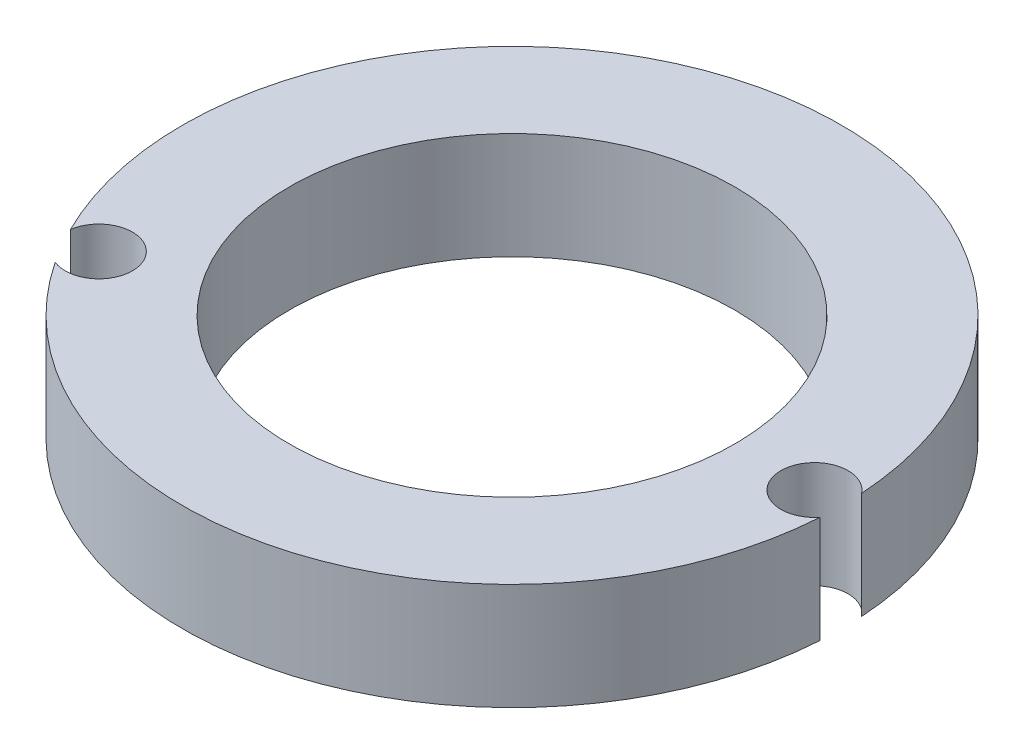
ISO-10303-21;
HEADER;
FILE_DESCRIPTION(('STEP AP214'),'2;1');
FILE_NAME('part.step','',(''),(''),'','','');
FILE_SCHEMA(('AUTOMOTIVE_DESIGN { 1 0 10303 214 1 1 1 1 }'));
ENDSEC;
DATA;
#1=APPLICATION_CONTEXT('core data for automotive mechanical design processes');
#2=APPLICATION_PROTOCOL_DEFINITION('international standard','automotive_design',2000,#1);
#3=PRODUCT_CONTEXT('',#1,'mechanical');
#4=PRODUCT('Part','Part','',(#3));
#5=PRODUCT_RELATED_PRODUCT_CATEGORY('part','',(#4));
#6=PRODUCT_DEFINITION_FORMATION('','',#4);
#7=PRODUCT_DEFINITION_CONTEXT('part definition',#1,'design');
#8=PRODUCT_DEFINITION('design','',#6,#7);
#9=PRODUCT_DEFINITION_SHAPE('','',#8);
#10=(LENGTH_UNIT() NAMED_UNIT(*) SI_UNIT(.MILLI.,.METRE.));
#11=(NAMED_UNIT(*) PLANE_ANGLE_UNIT() SI_UNIT($,.RADIAN.));
#12=(NAMED_UNIT(*) SI_UNIT($,.STERADIAN.) SOLID_ANGLE_UNIT());
#13=UNCERTAINTY_MEASURE_WITH_UNIT(LENGTH_MEASURE(1.E-05),#10,'distance_accuracy_value','');
#14=(GEOMETRIC_REPRESENTATION_CONTEXT(3) GLOBAL_UNCERTAINTY_ASSIGNED_CONTEXT((#13)) GLOBAL_UNIT_ASSIGNED_CONTEXT((#10,
#11,#12)) REPRESENTATION_CONTEXT('',''));
#15=CARTESIAN_POINT('',(0.,0.,0.));
#16=DIRECTION('',(0.,0.,1.));
#17=DIRECTION('',(1.,0.,0.));
#18=AXIS2_PLACEMENT_3D('',#15,#16,#17);
#19=CARTESIAN_POINT('',(0.,0.,0.));
#20=DIRECTION('',(0.,-1.,0.));
#21=DIRECTION('',(0.,0.,-1.));
#22=AXIS2_PLACEMENT_3D('',#19,#20,#21);
#23=CYLINDRICAL_SURFACE('',#22,39.22);
#24=CARTESIAN_POINT('',(0.,268.946616264269,0.));
#25=DIRECTION('',(0.,-1.,0.));
#26=DIRECTION('',(0.,0.,-1.));
#27=AXIS2_PLACEMENT_3D('',#24,#25,#26);
#28=CIRCLE('',#27,39.22);
#29=CARTESIAN_POINT('',(-35.1356395207061,268.946616264269,17.4268538603786));
#30=VERTEX_POINT('',#29);
#31=CARTESIAN_POINT('',(39.1417833333333,268.946616264269,-2.47572160922603));
#32=VERTEX_POINT('',#31);
#33=EDGE_CURVE('E87',#30,#32,#28,.T.);
#34=ORIENTED_EDGE('',*,*,#33,.F.);
#35=DIRECTION('',(0.,-1.,0.));
#36=VECTOR('',#35,1.);
#37=CARTESIAN_POINT('',(-35.1356395207061,140.823308132135,17.4268538603786));
#38=LINE('',#37,#36);
#39=CARTESIAN_POINT('',(-35.1356395207061,281.646616264269,17.4268538603786));
#40=VERTEX_POINT('',#39);
#41=EDGE_CURVE('E99',#30,#40,#38,.F.);
#42=ORIENTED_EDGE('',*,*,#41,.T.);
#43=CARTESIAN_POINT('',(0.,281.646616264269,0.));
#44=DIRECTION('',(0.,-1.,0.));
#45=DIRECTION('',(0.,0.,-1.));
#46=AXIS2_PLACEMENT_3D('',#43,#44,#45);
#47=CIRCLE('',#46,39.22);
#48=CARTESIAN_POINT('',(39.1417833333333,281.646616264269,-2.47572160922602));
#49=VERTEX_POINT('',#48);
#50=EDGE_CURVE('E88',#40,#49,#47,.T.);
#51=ORIENTED_EDGE('',*,*,#50,.T.);
#52=DIRECTION('',(0.,-1.,0.));
#53=VECTOR('',#52,1.);
#54=CARTESIAN_POINT('',(39.1417833333333,140.823308132135,-2.47572160922604));
#55=LINE('',#54,#53);
#56=EDGE_CURVE('E54',#49,#32,#55,.T.);
#57=ORIENTED_EDGE('',*,*,#56,.T.);
#58=EDGE_LOOP('',(#34,#42,#51,#57));
#59=FACE_BOUND('',#58,.T.);
#60=ADVANCED_FACE('F32',(#59),#23,.T.);
#61=CARTESIAN_POINT('',(39.1417833333333,281.646616264269,2.47572160922604));
#62=VERTEX_POINT('',#61);
#63=CARTESIAN_POINT('',(-32.6599179114801,281.646616264269,21.7149294729543));
#64=VERTEX_POINT('',#63);
#65=EDGE_CURVE('E82',#62,#64,#47,.T.);
#66=ORIENTED_EDGE('',*,*,#65,.T.);
#67=DIRECTION('',(0.,-1.,0.));
#68=VECTOR('',#67,1.);
#69=CARTESIAN_POINT('',(-32.6599179114801,140.823308132135,21.7149294729543));
#70=LINE('',#69,#68);
#71=CARTESIAN_POINT('',(-32.6599179114801,268.946616264269,21.7149294729543));
#72=VERTEX_POINT('',#71);
#73=EDGE_CURVE('E47',#64,#72,#70,.T.);
#74=ORIENTED_EDGE('',*,*,#73,.T.);
#75=CARTESIAN_POINT('',(39.1417833333333,268.946616264269,2.47572160922602));
#76=VERTEX_POINT('',#75);
#77=EDGE_CURVE('E77',#76,#72,#28,.T.);
#78=ORIENTED_EDGE('',*,*,#77,.F.);
#79=DIRECTION('',(0.,-1.,0.));
#80=VECTOR('',#79,1.);
#81=CARTESIAN_POINT('',(39.1417833333333,140.823308132135,2.47572160922604));
#82=LINE('',#81,#80);
#83=EDGE_CURVE('E71',#76,#62,#82,.F.);
#84=ORIENTED_EDGE('',*,*,#83,.T.);
#85=EDGE_LOOP('',(#66,#74,#78,#84));
#86=FACE_BOUND('',#85,.T.);
#87=ADVANCED_FACE('F81',(#86),#23,.T.);
#88=CARTESIAN_POINT('',(39.22,268.946616264269,0.));
#89=DIRECTION('',(0.,-1.,0.));
#90=DIRECTION('',(0.,0.,-1.));
#91=AXIS2_PLACEMENT_3D('',#88,#89,#90);
#92=PLANE('',#91);
#93=ORIENTED_EDGE('',*,*,#77,.T.);
#94=CARTESIAN_POINT('',(-31.1769145362399,268.946616264269,17.9999999999998));
#95=DIRECTION('',(0.,-1.,0.));
#96=DIRECTION('',(0.,0.,-1.));
#97=AXIS2_PLACEMENT_3D('',#94,#95,#96);
#98=CIRCLE('',#97,4.);
#99=EDGE_CURVE('E102',#72,#30,#98,.F.);
#100=ORIENTED_EDGE('',*,*,#99,.T.);
#101=ORIENTED_EDGE('',*,*,#33,.T.);
#102=CARTESIAN_POINT('',(36.,268.946616264269,0.));
#103=DIRECTION('',(0.,-1.,0.));
#104=DIRECTION('',(0.,0.,-1.));
#105=AXIS2_PLACEMENT_3D('',#102,#103,#104);
#106=CIRCLE('',#105,4.);
#107=EDGE_CURVE('E84',#32,#76,#106,.F.);
#108=ORIENTED_EDGE('',*,*,#107,.T.);
#109=EDGE_LOOP('',(#93,#100,#101,#108));
#110=FACE_BOUND('',#109,.T.);
#111=CARTESIAN_POINT('',(0.,268.946616264269,0.));
#112=DIRECTION('',(0.,-1.,0.));
#113=DIRECTION('',(0.,0.,-1.));
#114=AXIS2_PLACEMENT_3D('',#111,#112,#113);
#115=CIRCLE('',#114,26.51);
#116=CARTESIAN_POINT('',(0.,268.946616264269,-26.51));
#117=VERTEX_POINT('',#116);
#118=EDGE_CURVE('E96',#117,#117,#115,.T.);
#119=ORIENTED_EDGE('',*,*,#118,.F.);
#120=EDGE_LOOP('',(#119));
#121=FACE_BOUND('',#120,.T.);
#122=ADVANCED_FACE('F34',(#110,#121),#92,.T.);
#123=CARTESIAN_POINT('',(39.22,281.646616264269,0.));
#124=DIRECTION('',(0.,1.,0.));
#125=DIRECTION('',(0.,0.,1.));
#126=AXIS2_PLACEMENT_3D('',#123,#124,#125);
#127=PLANE('',#126);
#128=CARTESIAN_POINT('',(0.,281.646616264269,0.));
#129=DIRECTION('',(0.,-1.,0.));
#130=DIRECTION('',(0.,0.,-1.));
#131=AXIS2_PLACEMENT_3D('',#128,#129,#130);
#132=CIRCLE('',#131,26.51);
#133=CARTESIAN_POINT('',(0.,281.646616264269,-26.51));
#134=VERTEX_POINT('',#133);
#135=EDGE_CURVE('E92',#134,#134,#132,.T.);
#136=ORIENTED_EDGE('',*,*,#135,.T.);
#137=EDGE_LOOP('',(#136));
#138=FACE_BOUND('',#137,.T.);
#139=ORIENTED_EDGE('',*,*,#50,.F.);
#140=CARTESIAN_POINT('',(-31.1769145362399,281.646616264269,17.9999999999998));
#141=DIRECTION('',(0.,1.,0.));
#142=DIRECTION('',(0.,0.,1.));
#143=AXIS2_PLACEMENT_3D('',#140,#141,#142);
#144=CIRCLE('',#143,4.);
#145=EDGE_CURVE('E11',#40,#64,#144,.F.);
#146=ORIENTED_EDGE('',*,*,#145,.T.);
#147=ORIENTED_EDGE('',*,*,#65,.F.);
#148=CARTESIAN_POINT('',(36.,281.646616264269,0.));
#149=DIRECTION('',(0.,1.,0.));
#150=DIRECTION('',(0.,0.,1.));
#151=AXIS2_PLACEMENT_3D('',#148,#149,#150);
#152=CIRCLE('',#151,4.);
#153=EDGE_CURVE('E40',#62,#49,#152,.F.);
#154=ORIENTED_EDGE('',*,*,#153,.T.);
#155=EDGE_LOOP('',(#139,#146,#147,#154));
#156=FACE_BOUND('',#155,.T.);
#157=ADVANCED_FACE('F86',(#138,#156),#127,.T.);
#158=CARTESIAN_POINT('',(0.,0.,0.));
#159=DIRECTION('',(0.,-1.,0.));
#160=DIRECTION('',(0.,0.,-1.));
#161=AXIS2_PLACEMENT_3D('',#158,#159,#160);
#162=CYLINDRICAL_SURFACE('',#161,26.51);
#163=ORIENTED_EDGE('',*,*,#118,.T.);
#164=EDGE_LOOP('',(#163));
#165=FACE_BOUND('',#164,.T.);
#166=ORIENTED_EDGE('',*,*,#135,.F.);
#167=EDGE_LOOP('',(#166));
#168=FACE_BOUND('',#167,.T.);
#169=ADVANCED_FACE('F117',(#165,#168),#162,.F.);
#170=CARTESIAN_POINT('',(36.,281.646616264269,0.));
#171=DIRECTION('',(0.,-1.,0.));
#172=DIRECTION('',(0.,0.,-1.));
#173=AXIS2_PLACEMENT_3D('',#170,#171,#172);
#174=CYLINDRICAL_SURFACE('',#173,4.);
#175=ORIENTED_EDGE('',*,*,#107,.F.);
#176=ORIENTED_EDGE('',*,*,#56,.F.);
#177=ORIENTED_EDGE('',*,*,#153,.F.);
#178=ORIENTED_EDGE('',*,*,#83,.F.);
#179=EDGE_LOOP('',(#175,#176,#177,#178));
#180=FACE_BOUND('',#179,.T.);
#181=ADVANCED_FACE('F70',(#180),#174,.F.);
#182=CARTESIAN_POINT('',(-31.1769145362399,281.646616264269,17.9999999999998));
#183=DIRECTION('',(0.,-1.,0.));
#184=DIRECTION('',(0.,0.,-1.));
#185=AXIS2_PLACEMENT_3D('',#182,#183,#184);
#186=CYLINDRICAL_SURFACE('',#185,4.);
#187=ORIENTED_EDGE('',*,*,#99,.F.);
#188=ORIENTED_EDGE('',*,*,#73,.F.);
#189=ORIENTED_EDGE('',*,*,#145,.F.);
#190=ORIENTED_EDGE('',*,*,#41,.F.);
#191=EDGE_LOOP('',(#187,#188,#189,#190));
#192=FACE_BOUND('',#191,.T.);
#193=ADVANCED_FACE('F111',(#192),#186,.F.);
#194=CLOSED_SHELL('',(#60,#87,#122,#157,#169,#181,#193));
#195=MANIFOLD_SOLID_BREP('B2',#194);
#196=ADVANCED_BREP_SHAPE_REPRESENTATION('',(#18,#195),#14);
#197=SHAPE_DEFINITION_REPRESENTATION(#9,#196);
ENDSEC;
END-ISO-10303-21;
